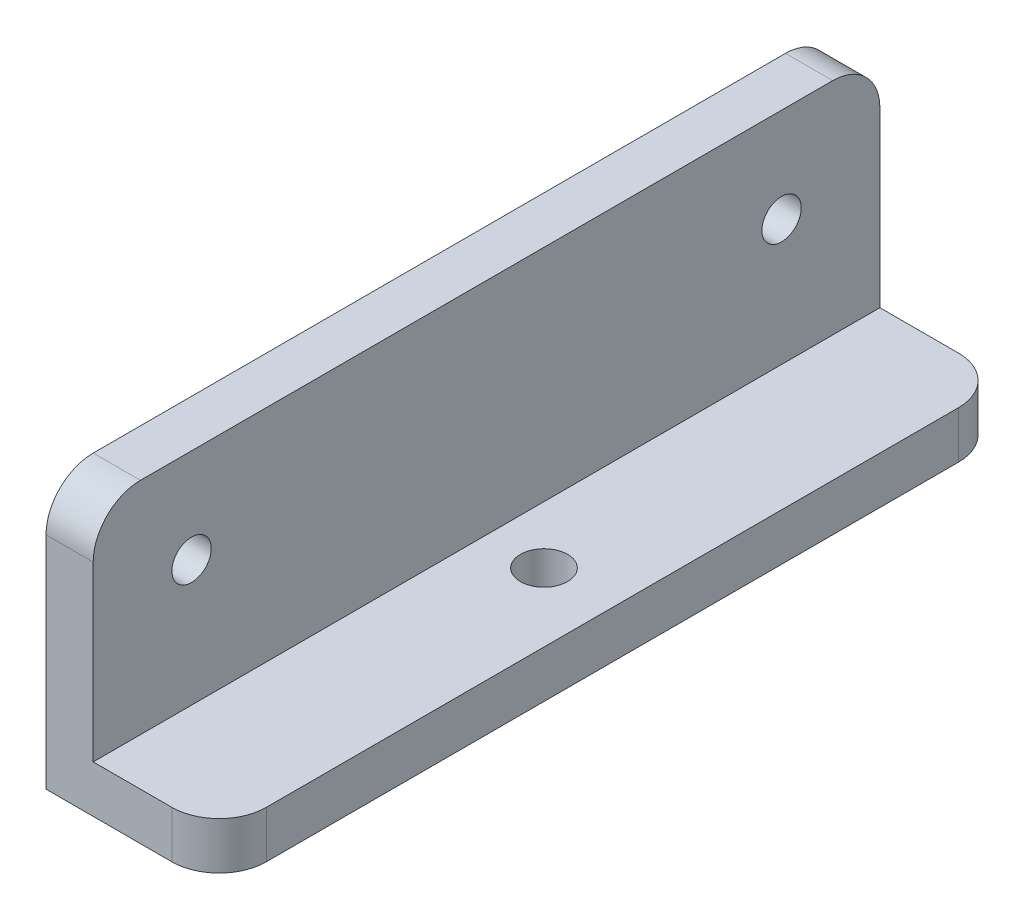
ISO-10303-21;
HEADER;
FILE_DESCRIPTION(('STEP AP214'),'2;1');
FILE_NAME('part.step','',(''),(''),'','','');
FILE_SCHEMA(('AUTOMOTIVE_DESIGN { 1 0 10303 214 1 1 1 1 }'));
ENDSEC;
DATA;
#1=APPLICATION_CONTEXT('core data for automotive mechanical design processes');
#2=APPLICATION_PROTOCOL_DEFINITION('international standard','automotive_design',2000,#1);
#3=PRODUCT_CONTEXT('',#1,'mechanical');
#4=PRODUCT('Part','Part','',(#3));
#5=PRODUCT_RELATED_PRODUCT_CATEGORY('part','',(#4));
#6=PRODUCT_DEFINITION_FORMATION('','',#4);
#7=PRODUCT_DEFINITION_CONTEXT('part definition',#1,'design');
#8=PRODUCT_DEFINITION('design','',#6,#7);
#9=PRODUCT_DEFINITION_SHAPE('','',#8);
#10=(LENGTH_UNIT() NAMED_UNIT(*) SI_UNIT(.MILLI.,.METRE.));
#11=(NAMED_UNIT(*) PLANE_ANGLE_UNIT() SI_UNIT($,.RADIAN.));
#12=(NAMED_UNIT(*) SI_UNIT($,.STERADIAN.) SOLID_ANGLE_UNIT());
#13=UNCERTAINTY_MEASURE_WITH_UNIT(LENGTH_MEASURE(1.E-05),#10,'distance_accuracy_value','');
#14=(GEOMETRIC_REPRESENTATION_CONTEXT(3) GLOBAL_UNCERTAINTY_ASSIGNED_CONTEXT((#13)) GLOBAL_UNIT_ASSIGNED_CONTEXT((#10,
#11,#12)) REPRESENTATION_CONTEXT('',''));
#15=CARTESIAN_POINT('',(0.,0.,0.));
#16=DIRECTION('',(0.,0.,1.));
#17=DIRECTION('',(1.,0.,0.));
#18=AXIS2_PLACEMENT_3D('',#15,#16,#17);
#19=CARTESIAN_POINT('',(6.,34.,50.));
#20=DIRECTION('',(0.,-1.,0.));
#21=DIRECTION('',(0.,0.,-1.));
#22=AXIS2_PLACEMENT_3D('',#19,#20,#21);
#23=PLANE('',#22);
#24=DIRECTION('',(0.,0.,-1.));
#25=VECTOR('',#24,1.);
#26=CARTESIAN_POINT('',(6.,34.,50.));
#27=LINE('',#26,#25);
#28=CARTESIAN_POINT('',(6.,34.,44.));
#29=VERTEX_POINT('',#28);
#30=CARTESIAN_POINT('',(6.,34.,-44.));
#31=VERTEX_POINT('',#30);
#32=EDGE_CURVE('E157',#29,#31,#27,.T.);
#33=ORIENTED_EDGE('',*,*,#32,.T.);
#34=DIRECTION('',(-1.,0.,0.));
#35=VECTOR('',#34,1.);
#36=CARTESIAN_POINT('',(6.,34.,-44.));
#37=LINE('',#36,#35);
#38=CARTESIAN_POINT('',(0.,34.,-44.));
#39=VERTEX_POINT('',#38);
#40=EDGE_CURVE('E213',#31,#39,#37,.T.);
#41=ORIENTED_EDGE('',*,*,#40,.T.);
#42=DIRECTION('',(0.,0.,-1.));
#43=VECTOR('',#42,1.);
#44=CARTESIAN_POINT('',(0.,34.,50.));
#45=LINE('',#44,#43);
#46=CARTESIAN_POINT('',(0.,34.,44.));
#47=VERTEX_POINT('',#46);
#48=EDGE_CURVE('E140',#47,#39,#45,.T.);
#49=ORIENTED_EDGE('',*,*,#48,.F.);
#50=DIRECTION('',(-1.,0.,0.));
#51=VECTOR('',#50,1.);
#52=CARTESIAN_POINT('',(6.,34.,44.));
#53=LINE('',#52,#51);
#54=EDGE_CURVE('E210',#47,#29,#53,.F.);
#55=ORIENTED_EDGE('',*,*,#54,.T.);
#56=EDGE_LOOP('',(#33,#41,#49,#55));
#57=FACE_BOUND('',#56,.T.);
#58=ADVANCED_FACE('F39',(#57),#23,.F.);
#59=CARTESIAN_POINT('',(0.,34.,50.));
#60=DIRECTION('',(1.,0.,0.));
#61=DIRECTION('',(0.,0.,-1.));
#62=AXIS2_PLACEMENT_3D('',#59,#60,#61);
#63=PLANE('',#62);
#64=CARTESIAN_POINT('',(0.,22.,37.5));
#65=DIRECTION('',(1.,0.,0.));
#66=DIRECTION('',(0.,0.,-1.));
#67=AXIS2_PLACEMENT_3D('',#64,#65,#66);
#68=CIRCLE('',#67,2.5);
#69=CARTESIAN_POINT('',(0.,22.,35.));
#70=VERTEX_POINT('',#69);
#71=EDGE_CURVE('E161',#70,#70,#68,.F.);
#72=ORIENTED_EDGE('',*,*,#71,.F.);
#73=EDGE_LOOP('',(#72));
#74=FACE_BOUND('',#73,.T.);
#75=CARTESIAN_POINT('',(0.,22.,-37.5));
#76=DIRECTION('',(1.,0.,0.));
#77=DIRECTION('',(0.,0.,-1.));
#78=AXIS2_PLACEMENT_3D('',#75,#76,#77);
#79=CIRCLE('',#78,2.5);
#80=CARTESIAN_POINT('',(0.,22.,-40.));
#81=VERTEX_POINT('',#80);
#82=EDGE_CURVE('E393',#81,#81,#79,.F.);
#83=ORIENTED_EDGE('',*,*,#82,.F.);
#84=EDGE_LOOP('',(#83));
#85=FACE_BOUND('',#84,.T.);
#86=ORIENTED_EDGE('',*,*,#48,.T.);
#87=CARTESIAN_POINT('',(0.,28.,-44.));
#88=DIRECTION('',(1.,0.,0.));
#89=DIRECTION('',(0.,0.,-1.));
#90=AXIS2_PLACEMENT_3D('',#87,#88,#89);
#91=CIRCLE('',#90,6.);
#92=CARTESIAN_POINT('',(0.,28.,-50.));
#93=VERTEX_POINT('',#92);
#94=EDGE_CURVE('E219',#39,#93,#91,.F.);
#95=ORIENTED_EDGE('',*,*,#94,.T.);
#96=DIRECTION('',(0.,-1.,0.));
#97=VECTOR('',#96,1.);
#98=CARTESIAN_POINT('',(0.,34.,-50.));
#99=LINE('',#98,#97);
#100=CARTESIAN_POINT('',(0.,0.,-50.));
#101=VERTEX_POINT('',#100);
#102=EDGE_CURVE('E135',#93,#101,#99,.T.);
#103=ORIENTED_EDGE('',*,*,#102,.T.);
#104=DIRECTION('',(0.,0.,-1.));
#105=VECTOR('',#104,1.);
#106=CARTESIAN_POINT('',(0.,0.,50.));
#107=LINE('',#106,#105);
#108=CARTESIAN_POINT('',(0.,0.,50.));
#109=VERTEX_POINT('',#108);
#110=EDGE_CURVE('E131',#109,#101,#107,.T.);
#111=ORIENTED_EDGE('',*,*,#110,.F.);
#112=DIRECTION('',(0.,-1.,0.));
#113=VECTOR('',#112,1.);
#114=CARTESIAN_POINT('',(0.,34.,50.));
#115=LINE('',#114,#113);
#116=CARTESIAN_POINT('',(0.,28.,50.));
#117=VERTEX_POINT('',#116);
#118=EDGE_CURVE('E119',#117,#109,#115,.T.);
#119=ORIENTED_EDGE('',*,*,#118,.F.);
#120=CARTESIAN_POINT('',(0.,28.,44.));
#121=DIRECTION('',(1.,0.,0.));
#122=DIRECTION('',(0.,0.,-1.));
#123=AXIS2_PLACEMENT_3D('',#120,#121,#122);
#124=CIRCLE('',#123,6.);
#125=EDGE_CURVE('E63',#117,#47,#124,.F.);
#126=ORIENTED_EDGE('',*,*,#125,.T.);
#127=EDGE_LOOP('',(#86,#95,#103,#111,#119,#126));
#128=FACE_BOUND('',#127,.T.);
#129=ADVANCED_FACE('F133',(#74,#85,#128),#63,.F.);
#130=CARTESIAN_POINT('',(0.,0.,50.));
#131=DIRECTION('',(0.,1.,0.));
#132=DIRECTION('',(0.,0.,1.));
#133=AXIS2_PLACEMENT_3D('',#130,#131,#132);
#134=PLANE('',#133);
#135=CARTESIAN_POINT('',(13.3,0.,0.));
#136=DIRECTION('',(0.,1.,0.));
#137=DIRECTION('',(0.,0.,1.));
#138=AXIS2_PLACEMENT_3D('',#135,#136,#137);
#139=CIRCLE('',#138,3.);
#140=CARTESIAN_POINT('',(13.3,0.,3.));
#141=VERTEX_POINT('',#140);
#142=EDGE_CURVE('E384',#141,#141,#139,.F.);
#143=ORIENTED_EDGE('',*,*,#142,.F.);
#144=EDGE_LOOP('',(#143));
#145=FACE_BOUND('',#144,.T.);
#146=DIRECTION('',(1.,0.,0.));
#147=VECTOR('',#146,1.);
#148=CARTESIAN_POINT('',(0.,0.,-50.));
#149=LINE('',#148,#147);
#150=CARTESIAN_POINT('',(16.,0.,-50.));
#151=VERTEX_POINT('',#150);
#152=EDGE_CURVE('E160',#101,#151,#149,.T.);
#153=ORIENTED_EDGE('',*,*,#152,.T.);
#154=CARTESIAN_POINT('',(16.,0.,-44.));
#155=DIRECTION('',(0.,1.,0.));
#156=DIRECTION('',(0.,0.,1.));
#157=AXIS2_PLACEMENT_3D('',#154,#155,#156);
#158=CIRCLE('',#157,6.);
#159=CARTESIAN_POINT('',(22.,0.,-44.));
#160=VERTEX_POINT('',#159);
#161=EDGE_CURVE('E207',#151,#160,#158,.F.);
#162=ORIENTED_EDGE('',*,*,#161,.T.);
#163=DIRECTION('',(0.,0.,-1.));
#164=VECTOR('',#163,1.);
#165=CARTESIAN_POINT('',(22.,0.,50.));
#166=LINE('',#165,#164);
#167=CARTESIAN_POINT('',(22.,0.,44.));
#168=VERTEX_POINT('',#167);
#169=EDGE_CURVE('E141',#168,#160,#166,.T.);
#170=ORIENTED_EDGE('',*,*,#169,.F.);
#171=CARTESIAN_POINT('',(16.,0.,44.));
#172=DIRECTION('',(0.,1.,0.));
#173=DIRECTION('',(0.,0.,1.));
#174=AXIS2_PLACEMENT_3D('',#171,#172,#173);
#175=CIRCLE('',#174,6.);
#176=CARTESIAN_POINT('',(16.,0.,50.));
#177=VERTEX_POINT('',#176);
#178=EDGE_CURVE('E146',#168,#177,#175,.F.);
#179=ORIENTED_EDGE('',*,*,#178,.T.);
#180=DIRECTION('',(1.,0.,0.));
#181=VECTOR('',#180,1.);
#182=CARTESIAN_POINT('',(0.,0.,50.));
#183=LINE('',#182,#181);
#184=EDGE_CURVE('E124',#109,#177,#183,.T.);
#185=ORIENTED_EDGE('',*,*,#184,.F.);
#186=ORIENTED_EDGE('',*,*,#110,.T.);
#187=EDGE_LOOP('',(#153,#162,#170,#179,#185,#186));
#188=FACE_BOUND('',#187,.T.);
#189=ADVANCED_FACE('F143',(#145,#188),#134,.F.);
#190=CARTESIAN_POINT('',(22.,0.,50.));
#191=DIRECTION('',(-1.,0.,0.));
#192=DIRECTION('',(0.,0.,1.));
#193=AXIS2_PLACEMENT_3D('',#190,#191,#192);
#194=PLANE('',#193);
#195=ORIENTED_EDGE('',*,*,#169,.T.);
#196=DIRECTION('',(0.,1.,0.));
#197=VECTOR('',#196,1.);
#198=CARTESIAN_POINT('',(22.,0.,-44.));
#199=LINE('',#198,#197);
#200=CARTESIAN_POINT('',(22.,6.,-44.));
#201=VERTEX_POINT('',#200);
#202=EDGE_CURVE('E189',#160,#201,#199,.T.);
#203=ORIENTED_EDGE('',*,*,#202,.T.);
#204=DIRECTION('',(0.,0.,-1.));
#205=VECTOR('',#204,1.);
#206=CARTESIAN_POINT('',(22.,6.,50.));
#207=LINE('',#206,#205);
#208=CARTESIAN_POINT('',(22.,6.,44.));
#209=VERTEX_POINT('',#208);
#210=EDGE_CURVE('E177',#209,#201,#207,.T.);
#211=ORIENTED_EDGE('',*,*,#210,.F.);
#212=DIRECTION('',(0.,1.,0.));
#213=VECTOR('',#212,1.);
#214=CARTESIAN_POINT('',(22.,0.,44.));
#215=LINE('',#214,#213);
#216=EDGE_CURVE('E186',#209,#168,#215,.F.);
#217=ORIENTED_EDGE('',*,*,#216,.T.);
#218=EDGE_LOOP('',(#195,#203,#211,#217));
#219=FACE_BOUND('',#218,.T.);
#220=ADVANCED_FACE('F252',(#219),#194,.F.);
#221=CARTESIAN_POINT('',(22.,6.,50.));
#222=DIRECTION('',(0.,-1.,0.));
#223=DIRECTION('',(1.,0.,0.));
#224=AXIS2_PLACEMENT_3D('',#221,#222,#223);
#225=PLANE('',#224);
#226=CARTESIAN_POINT('',(13.3,5.99999999999999,0.));
#227=DIRECTION('',(0.,1.,0.));
#228=DIRECTION('',(-1.,0.,0.));
#229=AXIS2_PLACEMENT_3D('',#226,#227,#228);
#230=CIRCLE('',#229,3.);
#231=CARTESIAN_POINT('',(10.3,5.99999999999999,0.));
#232=VERTEX_POINT('',#231);
#233=EDGE_CURVE('E388',#232,#232,#230,.T.);
#234=ORIENTED_EDGE('',*,*,#233,.F.);
#235=EDGE_LOOP('',(#234));
#236=FACE_BOUND('',#235,.T.);
#237=ORIENTED_EDGE('',*,*,#210,.T.);
#238=CARTESIAN_POINT('',(16.,6.,-44.));
#239=DIRECTION('',(0.,-1.,0.));
#240=DIRECTION('',(1.,0.,0.));
#241=AXIS2_PLACEMENT_3D('',#238,#239,#240);
#242=CIRCLE('',#241,6.);
#243=CARTESIAN_POINT('',(16.,6.,-50.));
#244=VERTEX_POINT('',#243);
#245=EDGE_CURVE('E196',#201,#244,#242,.F.);
#246=ORIENTED_EDGE('',*,*,#245,.T.);
#247=DIRECTION('',(-1.,0.,0.));
#248=VECTOR('',#247,1.);
#249=CARTESIAN_POINT('',(22.,6.,-50.));
#250=LINE('',#249,#248);
#251=CARTESIAN_POINT('',(6.00000000000001,5.99999999999999,-50.));
#252=VERTEX_POINT('',#251);
#253=EDGE_CURVE('E164',#244,#252,#250,.T.);
#254=ORIENTED_EDGE('',*,*,#253,.T.);
#255=DIRECTION('',(0.,0.,-1.));
#256=VECTOR('',#255,1.);
#257=CARTESIAN_POINT('',(6.00000000000001,5.99999999999999,50.));
#258=LINE('',#257,#256);
#259=CARTESIAN_POINT('',(6.00000000000001,5.99999999999999,50.));
#260=VERTEX_POINT('',#259);
#261=EDGE_CURVE('E173',#260,#252,#258,.T.);
#262=ORIENTED_EDGE('',*,*,#261,.F.);
#263=DIRECTION('',(-1.,0.,0.));
#264=VECTOR('',#263,1.);
#265=CARTESIAN_POINT('',(22.,6.,50.));
#266=LINE('',#265,#264);
#267=CARTESIAN_POINT('',(16.,6.,50.));
#268=VERTEX_POINT('',#267);
#269=EDGE_CURVE('E148',#268,#260,#266,.T.);
#270=ORIENTED_EDGE('',*,*,#269,.F.);
#271=CARTESIAN_POINT('',(16.,6.,44.));
#272=DIRECTION('',(0.,-1.,0.));
#273=DIRECTION('',(1.,0.,0.));
#274=AXIS2_PLACEMENT_3D('',#271,#272,#273);
#275=CIRCLE('',#274,6.);
#276=EDGE_CURVE('E193',#268,#209,#275,.F.);
#277=ORIENTED_EDGE('',*,*,#276,.T.);
#278=EDGE_LOOP('',(#237,#246,#254,#262,#270,#277));
#279=FACE_BOUND('',#278,.T.);
#280=ADVANCED_FACE('F231',(#236,#279),#225,.F.);
#281=CARTESIAN_POINT('',(6.00000000000001,5.99999999999999,50.));
#282=DIRECTION('',(-1.,0.,0.));
#283=DIRECTION('',(0.,-1.,0.));
#284=AXIS2_PLACEMENT_3D('',#281,#282,#283);
#285=PLANE('',#284);
#286=CARTESIAN_POINT('',(6.,22.,37.5));
#287=DIRECTION('',(1.,0.,0.));
#288=DIRECTION('',(0.,1.,0.));
#289=AXIS2_PLACEMENT_3D('',#286,#287,#288);
#290=CIRCLE('',#289,2.5);
#291=CARTESIAN_POINT('',(6.,24.5,37.5));
#292=VERTEX_POINT('',#291);
#293=EDGE_CURVE('E398',#292,#292,#290,.T.);
#294=ORIENTED_EDGE('',*,*,#293,.F.);
#295=EDGE_LOOP('',(#294));
#296=FACE_BOUND('',#295,.T.);
#297=CARTESIAN_POINT('',(6.,22.,-37.5));
#298=DIRECTION('',(1.,0.,0.));
#299=DIRECTION('',(0.,-1.,0.));
#300=AXIS2_PLACEMENT_3D('',#297,#298,#299);
#301=CIRCLE('',#300,2.5);
#302=CARTESIAN_POINT('',(6.,19.5,-37.5));
#303=VERTEX_POINT('',#302);
#304=EDGE_CURVE('E387',#303,#303,#301,.T.);
#305=ORIENTED_EDGE('',*,*,#304,.F.);
#306=EDGE_LOOP('',(#305));
#307=FACE_BOUND('',#306,.T.);
#308=DIRECTION('',(0.,1.,0.));
#309=VECTOR('',#308,1.);
#310=CARTESIAN_POINT('',(6.00000000000001,5.99999999999999,-50.));
#311=LINE('',#310,#309);
#312=CARTESIAN_POINT('',(6.,28.,-50.));
#313=VERTEX_POINT('',#312);
#314=EDGE_CURVE('E128',#252,#313,#311,.T.);
#315=ORIENTED_EDGE('',*,*,#314,.T.);
#316=CARTESIAN_POINT('',(6.,28.,-44.));
#317=DIRECTION('',(-1.,0.,0.));
#318=DIRECTION('',(0.,-1.,0.));
#319=AXIS2_PLACEMENT_3D('',#316,#317,#318);
#320=CIRCLE('',#319,6.);
#321=EDGE_CURVE('E224',#313,#31,#320,.F.);
#322=ORIENTED_EDGE('',*,*,#321,.T.);
#323=ORIENTED_EDGE('',*,*,#32,.F.);
#324=CARTESIAN_POINT('',(6.,28.,44.));
#325=DIRECTION('',(-1.,0.,0.));
#326=DIRECTION('',(0.,-1.,0.));
#327=AXIS2_PLACEMENT_3D('',#324,#325,#326);
#328=CIRCLE('',#327,6.);
#329=CARTESIAN_POINT('',(6.,28.,50.));
#330=VERTEX_POINT('',#329);
#331=EDGE_CURVE('E55',#29,#330,#328,.F.);
#332=ORIENTED_EDGE('',*,*,#331,.T.);
#333=DIRECTION('',(0.,1.,0.));
#334=VECTOR('',#333,1.);
#335=CARTESIAN_POINT('',(6.00000000000001,5.99999999999999,50.));
#336=LINE('',#335,#334);
#337=EDGE_CURVE('E151',#260,#330,#336,.T.);
#338=ORIENTED_EDGE('',*,*,#337,.F.);
#339=ORIENTED_EDGE('',*,*,#261,.T.);
#340=EDGE_LOOP('',(#315,#322,#323,#332,#338,#339));
#341=FACE_BOUND('',#340,.T.);
#342=ADVANCED_FACE('F235',(#296,#307,#341),#285,.F.);
#343=CARTESIAN_POINT('',(0.,0.,50.));
#344=DIRECTION('',(0.,0.,1.));
#345=DIRECTION('',(1.,0.,0.));
#346=AXIS2_PLACEMENT_3D('',#343,#344,#345);
#347=PLANE('',#346);
#348=ORIENTED_EDGE('',*,*,#337,.T.);
#349=DIRECTION('',(-1.,0.,0.));
#350=VECTOR('',#349,1.);
#351=CARTESIAN_POINT('',(0.,28.,50.));
#352=LINE('',#351,#350);
#353=EDGE_CURVE('E11',#330,#117,#352,.T.);
#354=ORIENTED_EDGE('',*,*,#353,.T.);
#355=ORIENTED_EDGE('',*,*,#118,.T.);
#356=ORIENTED_EDGE('',*,*,#184,.T.);
#357=DIRECTION('',(0.,1.,0.));
#358=VECTOR('',#357,1.);
#359=CARTESIAN_POINT('',(16.,6.,50.));
#360=LINE('',#359,#358);
#361=EDGE_CURVE('E48',#177,#268,#360,.T.);
#362=ORIENTED_EDGE('',*,*,#361,.T.);
#363=ORIENTED_EDGE('',*,*,#269,.T.);
#364=EDGE_LOOP('',(#348,#354,#355,#356,#362,#363));
#365=FACE_BOUND('',#364,.T.);
#366=ADVANCED_FACE('F121',(#365),#347,.T.);
#367=CARTESIAN_POINT('',(0.,0.,-50.));
#368=DIRECTION('',(0.,0.,1.));
#369=DIRECTION('',(1.,0.,0.));
#370=AXIS2_PLACEMENT_3D('',#367,#368,#369);
#371=PLANE('',#370);
#372=ORIENTED_EDGE('',*,*,#253,.F.);
#373=DIRECTION('',(0.,1.,0.));
#374=VECTOR('',#373,1.);
#375=CARTESIAN_POINT('',(16.,0.,-50.));
#376=LINE('',#375,#374);
#377=EDGE_CURVE('E202',#244,#151,#376,.F.);
#378=ORIENTED_EDGE('',*,*,#377,.T.);
#379=ORIENTED_EDGE('',*,*,#152,.F.);
#380=ORIENTED_EDGE('',*,*,#102,.F.);
#381=DIRECTION('',(-1.,0.,0.));
#382=VECTOR('',#381,1.);
#383=CARTESIAN_POINT('',(0.,28.,-50.));
#384=LINE('',#383,#382);
#385=EDGE_CURVE('E199',#93,#313,#384,.F.);
#386=ORIENTED_EDGE('',*,*,#385,.T.);
#387=ORIENTED_EDGE('',*,*,#314,.F.);
#388=EDGE_LOOP('',(#372,#378,#379,#380,#386,#387));
#389=FACE_BOUND('',#388,.T.);
#390=ADVANCED_FACE('F245',(#389),#371,.F.);
#391=CARTESIAN_POINT('',(-0.0010000000000036,22.,-37.5));
#392=DIRECTION('',(1.,0.,0.));
#393=DIRECTION('',(0.,1.,0.));
#394=AXIS2_PLACEMENT_3D('',#391,#392,#393);
#395=CYLINDRICAL_SURFACE('',#394,2.5);
#396=ORIENTED_EDGE('',*,*,#304,.T.);
#397=EDGE_LOOP('',(#396));
#398=FACE_BOUND('',#397,.T.);
#399=ORIENTED_EDGE('',*,*,#82,.T.);
#400=EDGE_LOOP('',(#399));
#401=FACE_BOUND('',#400,.T.);
#402=ADVANCED_FACE('F309',(#398,#401),#395,.F.);
#403=CARTESIAN_POINT('',(-0.0010000000000036,22.,37.5));
#404=DIRECTION('',(1.,0.,0.));
#405=DIRECTION('',(0.,1.,0.));
#406=AXIS2_PLACEMENT_3D('',#403,#404,#405);
#407=CYLINDRICAL_SURFACE('',#406,2.5);
#408=ORIENTED_EDGE('',*,*,#293,.T.);
#409=EDGE_LOOP('',(#408));
#410=FACE_BOUND('',#409,.T.);
#411=ORIENTED_EDGE('',*,*,#71,.T.);
#412=EDGE_LOOP('',(#411));
#413=FACE_BOUND('',#412,.T.);
#414=ADVANCED_FACE('F300',(#410,#413),#407,.F.);
#415=CARTESIAN_POINT('',(13.3,-0.00100000000000534,0.));
#416=DIRECTION('',(0.,1.,0.));
#417=DIRECTION('',(-1.,0.,0.));
#418=AXIS2_PLACEMENT_3D('',#415,#416,#417);
#419=CYLINDRICAL_SURFACE('',#418,3.);
#420=ORIENTED_EDGE('',*,*,#233,.T.);
#421=EDGE_LOOP('',(#420));
#422=FACE_BOUND('',#421,.T.);
#423=ORIENTED_EDGE('',*,*,#142,.T.);
#424=EDGE_LOOP('',(#423));
#425=FACE_BOUND('',#424,.T.);
#426=ADVANCED_FACE('F269',(#422,#425),#419,.F.);
#427=CARTESIAN_POINT('',(16.,0.,-44.));
#428=DIRECTION('',(0.,1.,0.));
#429=DIRECTION('',(0.,0.,1.));
#430=AXIS2_PLACEMENT_3D('',#427,#428,#429);
#431=CYLINDRICAL_SURFACE('',#430,6.);
#432=ORIENTED_EDGE('',*,*,#161,.F.);
#433=ORIENTED_EDGE('',*,*,#377,.F.);
#434=ORIENTED_EDGE('',*,*,#245,.F.);
#435=ORIENTED_EDGE('',*,*,#202,.F.);
#436=EDGE_LOOP('',(#432,#433,#434,#435));
#437=FACE_BOUND('',#436,.T.);
#438=ADVANCED_FACE('F250',(#437),#431,.T.);
#439=CARTESIAN_POINT('',(6.,28.,-44.));
#440=DIRECTION('',(-1.,0.,0.));
#441=DIRECTION('',(0.,0.,1.));
#442=AXIS2_PLACEMENT_3D('',#439,#440,#441);
#443=CYLINDRICAL_SURFACE('',#442,6.);
#444=ORIENTED_EDGE('',*,*,#321,.F.);
#445=ORIENTED_EDGE('',*,*,#385,.F.);
#446=ORIENTED_EDGE('',*,*,#94,.F.);
#447=ORIENTED_EDGE('',*,*,#40,.F.);
#448=EDGE_LOOP('',(#444,#445,#446,#447));
#449=FACE_BOUND('',#448,.T.);
#450=ADVANCED_FACE('F243',(#449),#443,.T.);
#451=CARTESIAN_POINT('',(0.,28.,44.));
#452=DIRECTION('',(1.,0.,0.));
#453=DIRECTION('',(0.,0.,-1.));
#454=AXIS2_PLACEMENT_3D('',#451,#452,#453);
#455=CYLINDRICAL_SURFACE('',#454,6.);
#456=ORIENTED_EDGE('',*,*,#331,.F.);
#457=ORIENTED_EDGE('',*,*,#54,.F.);
#458=ORIENTED_EDGE('',*,*,#125,.F.);
#459=ORIENTED_EDGE('',*,*,#353,.F.);
#460=EDGE_LOOP('',(#456,#457,#458,#459));
#461=FACE_BOUND('',#460,.T.);
#462=ADVANCED_FACE('F236',(#461),#455,.T.);
#463=CARTESIAN_POINT('',(16.,0.,44.));
#464=DIRECTION('',(0.,-1.,0.));
#465=DIRECTION('',(0.,0.,-1.));
#466=AXIS2_PLACEMENT_3D('',#463,#464,#465);
#467=CYLINDRICAL_SURFACE('',#466,6.);
#468=ORIENTED_EDGE('',*,*,#178,.F.);
#469=ORIENTED_EDGE('',*,*,#216,.F.);
#470=ORIENTED_EDGE('',*,*,#276,.F.);
#471=ORIENTED_EDGE('',*,*,#361,.F.);
#472=EDGE_LOOP('',(#468,#469,#470,#471));
#473=FACE_BOUND('',#472,.T.);
#474=ADVANCED_FACE('F41',(#473),#467,.T.);
#475=CLOSED_SHELL('',(#58,#129,#189,#220,#280,#342,#366,#390,#402,#414,#426,#438,#450,#462,#474));
#476=MANIFOLD_SOLID_BREP('B2',#475);
#477=ADVANCED_BREP_SHAPE_REPRESENTATION('',(#18,#476),#14);
#478=SHAPE_DEFINITION_REPRESENTATION(#9,#477);
ENDSEC;
END-ISO-10303-21;
